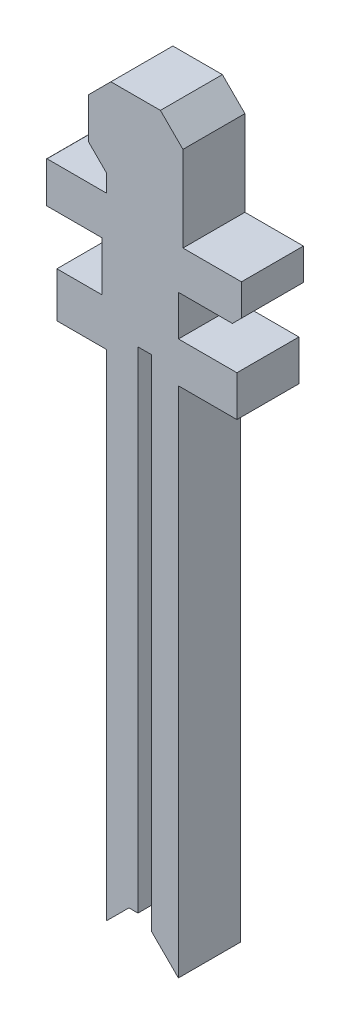
ISO-10303-21;
HEADER;
FILE_DESCRIPTION(('STEP AP214'),'2;1');
FILE_NAME('part.step','',(''),(''),'','','');
FILE_SCHEMA(('AUTOMOTIVE_DESIGN { 1 0 10303 214 1 1 1 1 }'));
ENDSEC;
DATA;
#1=APPLICATION_CONTEXT('core data for automotive mechanical design processes');
#2=APPLICATION_PROTOCOL_DEFINITION('international standard','automotive_design',2000,#1);
#3=PRODUCT_CONTEXT('',#1,'mechanical');
#4=PRODUCT('Part','Part','',(#3));
#5=PRODUCT_RELATED_PRODUCT_CATEGORY('part','',(#4));
#6=PRODUCT_DEFINITION_FORMATION('','',#4);
#7=PRODUCT_DEFINITION_CONTEXT('part definition',#1,'design');
#8=PRODUCT_DEFINITION('design','',#6,#7);
#9=PRODUCT_DEFINITION_SHAPE('','',#8);
#10=(LENGTH_UNIT() NAMED_UNIT(*) SI_UNIT(.MILLI.,.METRE.));
#11=(NAMED_UNIT(*) PLANE_ANGLE_UNIT() SI_UNIT($,.RADIAN.));
#12=(NAMED_UNIT(*) SI_UNIT($,.STERADIAN.) SOLID_ANGLE_UNIT());
#13=UNCERTAINTY_MEASURE_WITH_UNIT(LENGTH_MEASURE(1.E-05),#10,'distance_accuracy_value','');
#14=(GEOMETRIC_REPRESENTATION_CONTEXT(3) GLOBAL_UNCERTAINTY_ASSIGNED_CONTEXT((#13)) GLOBAL_UNIT_ASSIGNED_CONTEXT((#10,
#11,#12)) REPRESENTATION_CONTEXT('',''));
#15=CARTESIAN_POINT('',(0.,0.,0.));
#16=DIRECTION('',(0.,0.,1.));
#17=DIRECTION('',(1.,0.,0.));
#18=AXIS2_PLACEMENT_3D('',#15,#16,#17);
#19=CARTESIAN_POINT('',(-0.62866524,3.93915392,0.70000114));
#20=DIRECTION('',(0.,0.,-1.));
#21=DIRECTION('',(-1.,0.,0.));
#22=AXIS2_PLACEMENT_3D('',#19,#20,#21);
#23=PLANE('',#22);
#24=DIRECTION('',(-1.,0.,0.));
#25=VECTOR('',#24,1.);
#26=CARTESIAN_POINT('',(-0.62866524,-3.78711968,0.70000114));
#27=LINE('',#26,#25);
#28=CARTESIAN_POINT('',(-0.06854443999998,-3.78711968,0.70000114));
#29=VERTEX_POINT('',#28);
#30=CARTESIAN_POINT('',(-0.17046956,-3.78711968,0.70000114));
#31=VERTEX_POINT('',#30);
#32=EDGE_CURVE('E222',#29,#31,#27,.T.);
#33=ORIENTED_EDGE('',*,*,#32,.F.);
#34=DIRECTION('',(0.,1.,0.));
#35=VECTOR('',#34,1.);
#36=CARTESIAN_POINT('',(-0.06854443999998,-3.78711968,0.70000114));
#37=LINE('',#36,#35);
#38=CARTESIAN_POINT('',(-0.06854443999998,1.75305212,0.70000114));
#39=VERTEX_POINT('',#38);
#40=EDGE_CURVE('E456',#29,#39,#37,.T.);
#41=ORIENTED_EDGE('',*,*,#40,.T.);
#42=DIRECTION('',(1.,0.,0.));
#43=VECTOR('',#42,1.);
#44=CARTESIAN_POINT('',(-0.06854443999998,1.75305212,0.70000114));
#45=LINE('',#44,#43);
#46=CARTESIAN_POINT('',(0.08294116000002,1.75305212,0.70000114));
#47=VERTEX_POINT('',#46);
#48=EDGE_CURVE('E479',#39,#47,#45,.T.);
#49=ORIENTED_EDGE('',*,*,#48,.T.);
#50=DIRECTION('',(0.,1.,0.));
#51=VECTOR('',#50,1.);
#52=CARTESIAN_POINT('',(0.08294116000002,1.75305212,0.70000114));
#53=LINE('',#52,#51);
#54=CARTESIAN_POINT('',(0.08294116000002,-3.88849616,0.70000114));
#55=VERTEX_POINT('',#54);
#56=EDGE_CURVE('E252',#47,#55,#53,.F.);
#57=ORIENTED_EDGE('',*,*,#56,.T.);
#58=DIRECTION('',(-0.707300841758944,0.706912667340944,0.));
#59=VECTOR('',#58,1.);
#60=CARTESIAN_POINT('',(0.08294116000002,-3.88849616,0.70000114));
#61=LINE('',#60,#59);
#62=CARTESIAN_POINT('',(0.388582590884147,-4.19346289566701,0.70000114));
#63=VERTEX_POINT('',#62);
#64=EDGE_CURVE('E490',#55,#63,#61,.F.);
#65=ORIENTED_EDGE('',*,*,#64,.T.);
#66=DIRECTION('',(0.,1.,0.));
#67=VECTOR('',#66,1.);
#68=CARTESIAN_POINT('',(0.38890956,-4.19324028,0.70000114));
#69=LINE('',#68,#67);
#70=CARTESIAN_POINT('',(0.38890956,1.60057592,0.70000114));
#71=VERTEX_POINT('',#70);
#72=EDGE_CURVE('E290',#63,#71,#69,.T.);
#73=ORIENTED_EDGE('',*,*,#72,.T.);
#74=DIRECTION('',(1.,0.,0.));
#75=VECTOR('',#74,1.);
#76=CARTESIAN_POINT('',(0.38890956,1.60057592,0.70000114));
#77=LINE('',#76,#75);
#78=CARTESIAN_POINT('',(1.04966516,1.60057592,0.70000114));
#79=VERTEX_POINT('',#78);
#80=EDGE_CURVE('E301',#71,#79,#77,.T.);
#81=ORIENTED_EDGE('',*,*,#80,.T.);
#82=DIRECTION('',(0.,1.,0.));
#83=VECTOR('',#82,1.);
#84=CARTESIAN_POINT('',(1.04966516,1.60057592,0.70000114));
#85=LINE('',#84,#83);
#86=CARTESIAN_POINT('',(1.04966516,2.05904592,0.70000114));
#87=VERTEX_POINT('',#86);
#88=EDGE_CURVE('E306',#79,#87,#85,.T.);
#89=ORIENTED_EDGE('',*,*,#88,.T.);
#90=DIRECTION('',(1.,0.,0.));
#91=VECTOR('',#90,1.);
#92=CARTESIAN_POINT('',(1.04966516,2.05904592,0.70000114));
#93=LINE('',#92,#91);
#94=CARTESIAN_POINT('',(0.38890956,2.05904592,0.70000114));
#95=VERTEX_POINT('',#94);
#96=EDGE_CURVE('E311',#87,#95,#93,.F.);
#97=ORIENTED_EDGE('',*,*,#96,.T.);
#98=DIRECTION('',(0.,1.,0.));
#99=VECTOR('',#98,1.);
#100=CARTESIAN_POINT('',(0.38890956,2.05904592,0.70000114));
#101=LINE('',#100,#99);
#102=CARTESIAN_POINT('',(0.38890956,2.51548392,0.70000114));
#103=VERTEX_POINT('',#102);
#104=EDGE_CURVE('E316',#95,#103,#101,.T.);
#105=ORIENTED_EDGE('',*,*,#104,.T.);
#106=DIRECTION('',(1.,0.,0.));
#107=VECTOR('',#106,1.);
#108=CARTESIAN_POINT('',(0.38890956,2.51548392,0.70000114));
#109=LINE('',#108,#107);
#110=CARTESIAN_POINT('',(0.99854004,2.51548392,0.70000114));
#111=VERTEX_POINT('',#110);
#112=EDGE_CURVE('E321',#103,#111,#109,.T.);
#113=ORIENTED_EDGE('',*,*,#112,.T.);
#114=DIRECTION('',(-0.707106781186548,-0.707106781186548,0.));
#115=VECTOR('',#114,1.);
#116=CARTESIAN_POINT('',(0.99854004,2.51548392,0.70000114));
#117=LINE('',#116,#115);
#118=CARTESIAN_POINT('',(1.10049056,2.61743444,0.70000114));
#119=VERTEX_POINT('',#118);
#120=EDGE_CURVE('E326',#111,#119,#117,.F.);
#121=ORIENTED_EDGE('',*,*,#120,.T.);
#122=DIRECTION('',(0.,1.,0.));
#123=VECTOR('',#122,1.);
#124=CARTESIAN_POINT('',(1.10049056,2.61743444,0.70000114));
#125=LINE('',#124,#123);
#126=CARTESIAN_POINT('',(1.10049056,2.97392852,0.70000114));
#127=VERTEX_POINT('',#126);
#128=EDGE_CURVE('E331',#119,#127,#125,.T.);
#129=ORIENTED_EDGE('',*,*,#128,.T.);
#130=DIRECTION('',(1.,0.,0.));
#131=VECTOR('',#130,1.);
#132=CARTESIAN_POINT('',(1.10049056,2.97392852,0.70000114));
#133=LINE('',#132,#131);
#134=CARTESIAN_POINT('',(0.43973496,2.97392852,0.70000114));
#135=VERTEX_POINT('',#134);
#136=EDGE_CURVE('E336',#127,#135,#133,.F.);
#137=ORIENTED_EDGE('',*,*,#136,.T.);
#138=DIRECTION('',(0.,1.,0.));
#139=VECTOR('',#138,1.);
#140=CARTESIAN_POINT('',(0.43973496,2.97392852,0.70000114));
#141=LINE('',#140,#139);
#142=CARTESIAN_POINT('',(0.43973496,3.9393622,0.70000114));
#143=VERTEX_POINT('',#142);
#144=EDGE_CURVE('E341',#135,#143,#141,.T.);
#145=ORIENTED_EDGE('',*,*,#144,.T.);
#146=DIRECTION('',(0.707106781186548,-0.707106781186548,0.));
#147=VECTOR('',#146,1.);
#148=CARTESIAN_POINT('',(0.43973496,3.9393622,0.70000114));
#149=LINE('',#148,#147);
#150=CARTESIAN_POINT('',(0.18530824,4.19378892,0.70000114));
#151=VERTEX_POINT('',#150);
#152=EDGE_CURVE('E346',#143,#151,#149,.F.);
#153=ORIENTED_EDGE('',*,*,#152,.T.);
#154=DIRECTION('',(1.,0.,0.));
#155=VECTOR('',#154,1.);
#156=CARTESIAN_POINT('',(0.18530824,4.19378892,0.70000114));
#157=LINE('',#156,#155);
#158=CARTESIAN_POINT('',(-0.37423852,4.19378892,0.70000114));
#159=VERTEX_POINT('',#158);
#160=EDGE_CURVE('E351',#151,#159,#157,.F.);
#161=ORIENTED_EDGE('',*,*,#160,.T.);
#162=DIRECTION('',(0.706873902888643,0.707339582813643,0.));
#163=VECTOR('',#162,1.);
#164=CARTESIAN_POINT('',(-0.37423852,4.19378892,0.70000114));
#165=LINE('',#164,#163);
#166=CARTESIAN_POINT('',(-0.628670601009899,3.93917850830667,0.70000114));
#167=VERTEX_POINT('',#166);
#168=EDGE_CURVE('E587',#159,#167,#165,.F.);
#169=ORIENTED_EDGE('',*,*,#168,.T.);
#170=DIRECTION('',(0.,1.,0.));
#171=VECTOR('',#170,1.);
#172=CARTESIAN_POINT('',(-0.62866524,3.93915392,0.70000114));
#173=LINE('',#172,#171);
#174=CARTESIAN_POINT('',(-0.62866524,3.48151704,0.70000114));
#175=VERTEX_POINT('',#174);
#176=EDGE_CURVE('E388',#167,#175,#173,.F.);
#177=ORIENTED_EDGE('',*,*,#176,.T.);
#178=DIRECTION('',(-0.707106781186548,0.707106781186548,0.));
#179=VECTOR('',#178,1.);
#180=CARTESIAN_POINT('',(-0.62866524,3.48151704,0.70000114));
#181=LINE('',#180,#179);
#182=CARTESIAN_POINT('',(-0.42533824,3.27819004,0.70000114));
#183=VERTEX_POINT('',#182);
#184=EDGE_CURVE('E399',#175,#183,#181,.F.);
#185=ORIENTED_EDGE('',*,*,#184,.T.);
#186=DIRECTION('',(0.,1.,0.));
#187=VECTOR('',#186,1.);
#188=CARTESIAN_POINT('',(-0.42533824,3.27819004,0.70000114));
#189=LINE('',#188,#187);
#190=CARTESIAN_POINT('',(-0.42533824,3.07919374,0.70000114));
#191=VERTEX_POINT('',#190);
#192=EDGE_CURVE('E404',#183,#191,#189,.F.);
#193=ORIENTED_EDGE('',*,*,#192,.T.);
#194=DIRECTION('',(0.999999562297726,-0.000935630459489344,0.));
#195=VECTOR('',#194,1.);
#196=CARTESIAN_POINT('',(-0.42533824,3.07919374,0.70000114));
#197=LINE('',#196,#195);
#198=CARTESIAN_POINT('',(-1.09588046,3.07982112000001,0.70000114));
#199=VERTEX_POINT('',#198);
#200=EDGE_CURVE('E409',#191,#199,#197,.F.);
#201=ORIENTED_EDGE('',*,*,#200,.T.);
#202=DIRECTION('',(0.899966585375299,0.435958880180145,0.));
#203=VECTOR('',#202,1.);
#204=CARTESIAN_POINT('',(-1.09588046,3.07982112,0.70000114));
#205=LINE('',#204,#203);
#206=CARTESIAN_POINT('',(-1.09873288,3.07843936,0.70000114));
#207=VERTEX_POINT('',#206);
#208=EDGE_CURVE('E414',#199,#207,#205,.F.);
#209=ORIENTED_EDGE('',*,*,#208,.T.);
#210=DIRECTION('',(0.725732180307284,0.687977327000269,0.));
#211=VECTOR('',#210,1.);
#212=CARTESIAN_POINT('',(-1.09873288,3.07843936,0.70000114));
#213=LINE('',#212,#211);
#214=CARTESIAN_POINT('',(-1.10049056,3.07677312,0.70000114));
#215=VERTEX_POINT('',#214);
#216=EDGE_CURVE('E419',#207,#215,#213,.F.);
#217=ORIENTED_EDGE('',*,*,#216,.T.);
#218=DIRECTION('',(0.,1.,0.));
#219=VECTOR('',#218,1.);
#220=CARTESIAN_POINT('',(-1.10049056,3.07677312,0.70000114));
#221=LINE('',#220,#219);
#222=CARTESIAN_POINT('',(-1.10049056,2.61713472,0.70000114));
#223=VERTEX_POINT('',#222);
#224=EDGE_CURVE('E424',#215,#223,#221,.F.);
#225=ORIENTED_EDGE('',*,*,#224,.T.);
#226=DIRECTION('',(1.,0.,0.));
#227=VECTOR('',#226,1.);
#228=CARTESIAN_POINT('',(-1.10049056,2.61713472,0.70000114));
#229=LINE('',#228,#227);
#230=CARTESIAN_POINT('',(-0.47616364,2.61713472,0.70000114));
#231=VERTEX_POINT('',#230);
#232=EDGE_CURVE('E429',#223,#231,#229,.T.);
#233=ORIENTED_EDGE('',*,*,#232,.T.);
#234=DIRECTION('',(0.,1.,0.));
#235=VECTOR('',#234,1.);
#236=CARTESIAN_POINT('',(-0.47616364,2.61713472,0.70000114));
#237=LINE('',#236,#235);
#238=CARTESIAN_POINT('',(-0.47616364,2.05904592,0.70000114));
#239=VERTEX_POINT('',#238);
#240=EDGE_CURVE('E434',#231,#239,#237,.F.);
#241=ORIENTED_EDGE('',*,*,#240,.T.);
#242=DIRECTION('',(1.,0.,0.));
#243=VECTOR('',#242,1.);
#244=CARTESIAN_POINT('',(-0.47616364,2.05904592,0.70000114));
#245=LINE('',#244,#243);
#246=CARTESIAN_POINT('',(-0.98444304,2.05904592,0.70000114));
#247=VERTEX_POINT('',#246);
#248=EDGE_CURVE('E439',#239,#247,#245,.F.);
#249=ORIENTED_EDGE('',*,*,#248,.T.);
#250=DIRECTION('',(0.,1.,0.));
#251=VECTOR('',#250,1.);
#252=CARTESIAN_POINT('',(-0.98444304,2.05904592,0.70000114));
#253=LINE('',#252,#251);
#254=CARTESIAN_POINT('',(-0.98444304,1.54975052,0.70000114));
#255=VERTEX_POINT('',#254);
#256=EDGE_CURVE('E444',#247,#255,#253,.F.);
#257=ORIENTED_EDGE('',*,*,#256,.T.);
#258=DIRECTION('',(1.,0.,0.));
#259=VECTOR('',#258,1.);
#260=CARTESIAN_POINT('',(-0.98444304,1.54975052,0.70000114));
#261=LINE('',#260,#259);
#262=CARTESIAN_POINT('',(-0.42533824,1.54975052,0.70000114));
#263=VERTEX_POINT('',#262);
#264=EDGE_CURVE('E242',#255,#263,#261,.T.);
#265=ORIENTED_EDGE('',*,*,#264,.T.);
#266=DIRECTION('',(-9.08592831262369E-05,0.999999995872295,0.));
#267=VECTOR('',#266,1.);
#268=CARTESIAN_POINT('',(-0.42533824,1.54975052,0.70000114));
#269=LINE('',#268,#267);
#270=CARTESIAN_POINT('',(-0.424677193663149,-4.04114315684987,0.70000114));
#271=VERTEX_POINT('',#270);
#272=EDGE_CURVE('E239',#263,#271,#269,.F.);
#273=ORIENTED_EDGE('',*,*,#272,.T.);
#274=DIRECTION('',(-0.707106781186549,-0.707106781186546,0.));
#275=VECTOR('',#274,1.);
#276=CARTESIAN_POINT('',(-0.17046956,-3.78711968,0.70000114));
#277=LINE('',#276,#275);
#278=EDGE_CURVE('E228',#31,#271,#277,.T.);
#279=ORIENTED_EDGE('',*,*,#278,.F.);
#280=EDGE_LOOP('',(#33,#41,#49,#57,#65,#73,#81,#89,#97,#105,#113,#121,#129,#137,#145,#153,#161,
#169,#177,#185,#193,#201,#209,#217,#225,#233,#241,#249,#257,#265,#273,#279));
#281=FACE_BOUND('',#280,.T.);
#282=ADVANCED_FACE('F17',(#281),#23,.F.);
#283=CARTESIAN_POINT('',(-0.42533824,1.54975052,0.));
#284=DIRECTION('',(0.999999995872295,9.08592831262369E-05,0.));
#285=DIRECTION('',(-9.08592831262369E-05,0.999999995872295,0.));
#286=AXIS2_PLACEMENT_3D('',#283,#284,#285);
#287=PLANE('',#286);
#288=DIRECTION('',(0.,0.,1.));
#289=VECTOR('',#288,1.);
#290=CARTESIAN_POINT('',(-0.424830224769737,-4.04148034476974,0.));
#291=LINE('',#290,#289);
#292=CARTESIAN_POINT('',(-0.424677193663143,-4.04114315684987,0.));
#293=VERTEX_POINT('',#292);
#294=EDGE_CURVE('E236',#293,#271,#291,.T.);
#295=ORIENTED_EDGE('',*,*,#294,.T.);
#296=ORIENTED_EDGE('',*,*,#272,.F.);
#297=DIRECTION('',(0.,0.,1.));
#298=VECTOR('',#297,1.);
#299=CARTESIAN_POINT('',(-0.42533824,1.54975052,0.));
#300=LINE('',#299,#298);
#301=CARTESIAN_POINT('',(-0.42533824,1.54975052,0.));
#302=VERTEX_POINT('',#301);
#303=EDGE_CURVE('E446',#263,#302,#300,.F.);
#304=ORIENTED_EDGE('',*,*,#303,.T.);
#305=DIRECTION('',(-9.08592831310438E-05,0.999999995872295,0.));
#306=VECTOR('',#305,1.);
#307=CARTESIAN_POINT('',(-0.424830269181,-4.040991552779,0.));
#308=LINE('',#307,#306);
#309=EDGE_CURVE('E235',#293,#302,#308,.T.);
#310=ORIENTED_EDGE('',*,*,#309,.F.);
#311=EDGE_LOOP('',(#295,#296,#304,#310));
#312=FACE_BOUND('',#311,.T.);
#313=ADVANCED_FACE('F1002',(#312),#287,.F.);
#314=CARTESIAN_POINT('',(-0.98444304,1.54975052,0.));
#315=DIRECTION('',(0.,1.,0.));
#316=DIRECTION('',(0.,0.,1.));
#317=AXIS2_PLACEMENT_3D('',#314,#315,#316);
#318=PLANE('',#317);
#319=ORIENTED_EDGE('',*,*,#303,.F.);
#320=ORIENTED_EDGE('',*,*,#264,.F.);
#321=DIRECTION('',(0.,0.,-1.));
#322=VECTOR('',#321,1.);
#323=CARTESIAN_POINT('',(-0.98444304,1.54975052,0.));
#324=LINE('',#323,#322);
#325=CARTESIAN_POINT('',(-0.98444304,1.54975052,0.));
#326=VERTEX_POINT('',#325);
#327=EDGE_CURVE('E441',#255,#326,#324,.T.);
#328=ORIENTED_EDGE('',*,*,#327,.T.);
#329=DIRECTION('',(-1.,0.,0.));
#330=VECTOR('',#329,1.);
#331=CARTESIAN_POINT('',(-0.62866524,1.54975052,0.));
#332=LINE('',#331,#330);
#333=EDGE_CURVE('E670',#302,#326,#332,.T.);
#334=ORIENTED_EDGE('',*,*,#333,.F.);
#335=EDGE_LOOP('',(#319,#320,#328,#334));
#336=FACE_BOUND('',#335,.T.);
#337=ADVANCED_FACE('F992',(#336),#318,.F.);
#338=CARTESIAN_POINT('',(-0.98444304,2.05904592,0.));
#339=DIRECTION('',(1.,0.,0.));
#340=DIRECTION('',(0.,0.,-1.));
#341=AXIS2_PLACEMENT_3D('',#338,#339,#340);
#342=PLANE('',#341);
#343=ORIENTED_EDGE('',*,*,#327,.F.);
#344=ORIENTED_EDGE('',*,*,#256,.F.);
#345=DIRECTION('',(0.,0.,-1.));
#346=VECTOR('',#345,1.);
#347=CARTESIAN_POINT('',(-0.98444304,2.05904592,0.));
#348=LINE('',#347,#346);
#349=CARTESIAN_POINT('',(-0.98444304,2.05904592,0.));
#350=VERTEX_POINT('',#349);
#351=EDGE_CURVE('E436',#247,#350,#348,.T.);
#352=ORIENTED_EDGE('',*,*,#351,.T.);
#353=DIRECTION('',(0.,1.,0.));
#354=VECTOR('',#353,1.);
#355=CARTESIAN_POINT('',(-0.98444304,3.93915392,0.));
#356=LINE('',#355,#354);
#357=EDGE_CURVE('E662',#326,#350,#356,.T.);
#358=ORIENTED_EDGE('',*,*,#357,.F.);
#359=EDGE_LOOP('',(#343,#344,#352,#358));
#360=FACE_BOUND('',#359,.T.);
#361=ADVANCED_FACE('F982',(#360),#342,.F.);
#362=CARTESIAN_POINT('',(-0.47616364,2.05904592,0.));
#363=DIRECTION('',(0.,-1.,0.));
#364=DIRECTION('',(0.,0.,-1.));
#365=AXIS2_PLACEMENT_3D('',#362,#363,#364);
#366=PLANE('',#365);
#367=ORIENTED_EDGE('',*,*,#351,.F.);
#368=ORIENTED_EDGE('',*,*,#248,.F.);
#369=DIRECTION('',(0.,0.,-1.));
#370=VECTOR('',#369,1.);
#371=CARTESIAN_POINT('',(-0.47616364,2.05904592,0.));
#372=LINE('',#371,#370);
#373=CARTESIAN_POINT('',(-0.47616364,2.05904592,0.));
#374=VERTEX_POINT('',#373);
#375=EDGE_CURVE('E431',#239,#374,#372,.T.);
#376=ORIENTED_EDGE('',*,*,#375,.T.);
#377=DIRECTION('',(-1.,0.,0.));
#378=VECTOR('',#377,1.);
#379=CARTESIAN_POINT('',(-0.62866524,2.05904592,0.));
#380=LINE('',#379,#378);
#381=EDGE_CURVE('E654',#350,#374,#380,.F.);
#382=ORIENTED_EDGE('',*,*,#381,.F.);
#383=EDGE_LOOP('',(#367,#368,#376,#382));
#384=FACE_BOUND('',#383,.T.);
#385=ADVANCED_FACE('F972',(#384),#366,.F.);
#386=CARTESIAN_POINT('',(-0.47616364,2.61713472,0.));
#387=DIRECTION('',(1.,0.,0.));
#388=DIRECTION('',(0.,0.,-1.));
#389=AXIS2_PLACEMENT_3D('',#386,#387,#388);
#390=PLANE('',#389);
#391=ORIENTED_EDGE('',*,*,#375,.F.);
#392=ORIENTED_EDGE('',*,*,#240,.F.);
#393=DIRECTION('',(0.,0.,1.));
#394=VECTOR('',#393,1.);
#395=CARTESIAN_POINT('',(-0.47616364,2.61713472,0.));
#396=LINE('',#395,#394);
#397=CARTESIAN_POINT('',(-0.47616364,2.61713472,0.));
#398=VERTEX_POINT('',#397);
#399=EDGE_CURVE('E426',#231,#398,#396,.F.);
#400=ORIENTED_EDGE('',*,*,#399,.T.);
#401=DIRECTION('',(0.,1.,0.));
#402=VECTOR('',#401,1.);
#403=CARTESIAN_POINT('',(-0.47616364,3.93915392,0.));
#404=LINE('',#403,#402);
#405=EDGE_CURVE('E646',#374,#398,#404,.T.);
#406=ORIENTED_EDGE('',*,*,#405,.F.);
#407=EDGE_LOOP('',(#391,#392,#400,#406));
#408=FACE_BOUND('',#407,.T.);
#409=ADVANCED_FACE('F962',(#408),#390,.F.);
#410=CARTESIAN_POINT('',(-1.10049056,2.61713472,0.));
#411=DIRECTION('',(0.,1.,0.));
#412=DIRECTION('',(0.,0.,1.));
#413=AXIS2_PLACEMENT_3D('',#410,#411,#412);
#414=PLANE('',#413);
#415=ORIENTED_EDGE('',*,*,#399,.F.);
#416=ORIENTED_EDGE('',*,*,#232,.F.);
#417=DIRECTION('',(0.,0.,-1.));
#418=VECTOR('',#417,1.);
#419=CARTESIAN_POINT('',(-1.10049056,2.61713472,0.));
#420=LINE('',#419,#418);
#421=CARTESIAN_POINT('',(-1.10049056,2.61713472,0.));
#422=VERTEX_POINT('',#421);
#423=EDGE_CURVE('E421',#223,#422,#420,.T.);
#424=ORIENTED_EDGE('',*,*,#423,.T.);
#425=DIRECTION('',(-1.,0.,0.));
#426=VECTOR('',#425,1.);
#427=CARTESIAN_POINT('',(-0.62866524,2.61713472,0.));
#428=LINE('',#427,#426);
#429=EDGE_CURVE('E638',#398,#422,#428,.T.);
#430=ORIENTED_EDGE('',*,*,#429,.F.);
#431=EDGE_LOOP('',(#415,#416,#424,#430));
#432=FACE_BOUND('',#431,.T.);
#433=ADVANCED_FACE('F952',(#432),#414,.F.);
#434=CARTESIAN_POINT('',(-1.10049056,3.07677312,0.));
#435=DIRECTION('',(1.,0.,0.));
#436=DIRECTION('',(0.,0.,-1.));
#437=AXIS2_PLACEMENT_3D('',#434,#435,#436);
#438=PLANE('',#437);
#439=ORIENTED_EDGE('',*,*,#423,.F.);
#440=ORIENTED_EDGE('',*,*,#224,.F.);
#441=DIRECTION('',(0.,0.,1.));
#442=VECTOR('',#441,1.);
#443=CARTESIAN_POINT('',(-1.10049056,3.07677312,0.));
#444=LINE('',#443,#442);
#445=CARTESIAN_POINT('',(-1.10049056,3.07677312,0.));
#446=VERTEX_POINT('',#445);
#447=EDGE_CURVE('E416',#215,#446,#444,.F.);
#448=ORIENTED_EDGE('',*,*,#447,.T.);
#449=DIRECTION('',(0.,1.,0.));
#450=VECTOR('',#449,1.);
#451=CARTESIAN_POINT('',(-1.10049056,3.93915392,0.));
#452=LINE('',#451,#450);
#453=EDGE_CURVE('E630',#422,#446,#452,.T.);
#454=ORIENTED_EDGE('',*,*,#453,.F.);
#455=EDGE_LOOP('',(#439,#440,#448,#454));
#456=FACE_BOUND('',#455,.T.);
#457=ADVANCED_FACE('F942',(#456),#438,.F.);
#458=CARTESIAN_POINT('',(-1.09873288,3.07843936,0.));
#459=DIRECTION('',(0.687977327000269,-0.725732180307284,0.));
#460=DIRECTION('',(0.725732180307284,0.687977327000269,0.));
#461=AXIS2_PLACEMENT_3D('',#458,#459,#460);
#462=PLANE('',#461);
#463=ORIENTED_EDGE('',*,*,#447,.F.);
#464=ORIENTED_EDGE('',*,*,#216,.F.);
#465=DIRECTION('',(0.,0.,1.));
#466=VECTOR('',#465,1.);
#467=CARTESIAN_POINT('',(-1.09873288,3.07843936,0.));
#468=LINE('',#467,#466);
#469=CARTESIAN_POINT('',(-1.09873288,3.07843936,0.));
#470=VERTEX_POINT('',#469);
#471=EDGE_CURVE('E411',#207,#470,#468,.F.);
#472=ORIENTED_EDGE('',*,*,#471,.T.);
#473=DIRECTION('',(0.725732180309167,0.687977326998283,0.));
#474=VECTOR('',#473,1.);
#475=CARTESIAN_POINT('',(-1.10049056,3.07677312,0.));
#476=LINE('',#475,#474);
#477=EDGE_CURVE('E622',#446,#470,#476,.T.);
#478=ORIENTED_EDGE('',*,*,#477,.F.);
#479=EDGE_LOOP('',(#463,#464,#472,#478));
#480=FACE_BOUND('',#479,.T.);
#481=ADVANCED_FACE('F932',(#480),#462,.F.);
#482=CARTESIAN_POINT('',(-1.09588046,3.07982112,0.));
#483=DIRECTION('',(0.435958880180145,-0.899966585375299,0.));
#484=DIRECTION('',(0.899966585375299,0.435958880180145,0.));
#485=AXIS2_PLACEMENT_3D('',#482,#483,#484);
#486=PLANE('',#485);
#487=ORIENTED_EDGE('',*,*,#471,.F.);
#488=ORIENTED_EDGE('',*,*,#208,.F.);
#489=DIRECTION('',(0.,0.,1.));
#490=VECTOR('',#489,1.);
#491=CARTESIAN_POINT('',(-1.09588046,3.07982112000001,0.));
#492=LINE('',#491,#490);
#493=CARTESIAN_POINT('',(-1.09588046,3.07982112,0.));
#494=VERTEX_POINT('',#493);
#495=EDGE_CURVE('E406',#199,#494,#492,.F.);
#496=ORIENTED_EDGE('',*,*,#495,.T.);
#497=DIRECTION('',(0.899966585374593,0.435958880181602,0.));
#498=VECTOR('',#497,1.);
#499=CARTESIAN_POINT('',(-1.09873288,3.07843936,0.));
#500=LINE('',#499,#498);
#501=EDGE_CURVE('E614',#470,#494,#500,.T.);
#502=ORIENTED_EDGE('',*,*,#501,.F.);
#503=EDGE_LOOP('',(#487,#488,#496,#502));
#504=FACE_BOUND('',#503,.T.);
#505=ADVANCED_FACE('F922',(#504),#486,.F.);
#506=CARTESIAN_POINT('',(-0.42533824,3.07919374,0.));
#507=DIRECTION('',(-0.000935630459489344,-0.999999562297726,0.));
#508=DIRECTION('',(0.999999562297726,-0.000935630459489344,0.));
#509=AXIS2_PLACEMENT_3D('',#506,#507,#508);
#510=PLANE('',#509);
#511=ORIENTED_EDGE('',*,*,#495,.F.);
#512=ORIENTED_EDGE('',*,*,#200,.F.);
#513=DIRECTION('',(0.,0.,-1.));
#514=VECTOR('',#513,1.);
#515=CARTESIAN_POINT('',(-0.42533824,3.07919374,0.));
#516=LINE('',#515,#514);
#517=CARTESIAN_POINT('',(-0.42533824,3.07919374,0.));
#518=VERTEX_POINT('',#517);
#519=EDGE_CURVE('E401',#191,#518,#516,.T.);
#520=ORIENTED_EDGE('',*,*,#519,.T.);
#521=DIRECTION('',(0.999999562297726,-0.000935630459472887,0.));
#522=VECTOR('',#521,1.);
#523=CARTESIAN_POINT('',(-1.09588046,3.07982112,0.));
#524=LINE('',#523,#522);
#525=EDGE_CURVE('E606',#494,#518,#524,.T.);
#526=ORIENTED_EDGE('',*,*,#525,.F.);
#527=EDGE_LOOP('',(#511,#512,#520,#526));
#528=FACE_BOUND('',#527,.T.);
#529=ADVANCED_FACE('F913',(#528),#510,.F.);
#530=CARTESIAN_POINT('',(-0.42533824,3.27819004,0.));
#531=DIRECTION('',(1.,0.,0.));
#532=DIRECTION('',(0.,0.,-1.));
#533=AXIS2_PLACEMENT_3D('',#530,#531,#532);
#534=PLANE('',#533);
#535=ORIENTED_EDGE('',*,*,#519,.F.);
#536=ORIENTED_EDGE('',*,*,#192,.F.);
#537=DIRECTION('',(0.,0.,1.));
#538=VECTOR('',#537,1.);
#539=CARTESIAN_POINT('',(-0.42533824,3.27819004,0.));
#540=LINE('',#539,#538);
#541=CARTESIAN_POINT('',(-0.42533824,3.27819004,0.));
#542=VERTEX_POINT('',#541);
#543=EDGE_CURVE('E396',#183,#542,#540,.F.);
#544=ORIENTED_EDGE('',*,*,#543,.T.);
#545=DIRECTION('',(0.,1.,0.));
#546=VECTOR('',#545,1.);
#547=CARTESIAN_POINT('',(-0.42533824,3.93915392,0.));
#548=LINE('',#547,#546);
#549=EDGE_CURVE('E598',#518,#542,#548,.T.);
#550=ORIENTED_EDGE('',*,*,#549,.F.);
#551=EDGE_LOOP('',(#535,#536,#544,#550));
#552=FACE_BOUND('',#551,.T.);
#553=ADVANCED_FACE('F904',(#552),#534,.F.);
#554=CARTESIAN_POINT('',(-0.62866524,3.48151704,0.));
#555=DIRECTION('',(0.707106781186548,0.707106781186548,0.));
#556=DIRECTION('',(-0.707106781186548,0.707106781186548,0.));
#557=AXIS2_PLACEMENT_3D('',#554,#555,#556);
#558=PLANE('',#557);
#559=ORIENTED_EDGE('',*,*,#543,.F.);
#560=ORIENTED_EDGE('',*,*,#184,.F.);
#561=DIRECTION('',(0.,0.,-1.));
#562=VECTOR('',#561,1.);
#563=CARTESIAN_POINT('',(-0.62866524,3.48151704,0.));
#564=LINE('',#563,#562);
#565=CARTESIAN_POINT('',(-0.62866524,3.48151704,0.));
#566=VERTEX_POINT('',#565);
#567=EDGE_CURVE('E395',#175,#566,#564,.T.);
#568=ORIENTED_EDGE('',*,*,#567,.T.);
#569=DIRECTION('',(-0.707106781186547,0.707106781186548,0.));
#570=VECTOR('',#569,1.);
#571=CARTESIAN_POINT('',(-0.42533824,3.27819004,0.));
#572=LINE('',#571,#570);
#573=EDGE_CURVE('E594',#542,#566,#572,.T.);
#574=ORIENTED_EDGE('',*,*,#573,.F.);
#575=EDGE_LOOP('',(#559,#560,#568,#574));
#576=FACE_BOUND('',#575,.T.);
#577=ADVANCED_FACE('F382',(#576),#558,.F.);
#578=CARTESIAN_POINT('',(-0.62866524,3.93915392,0.));
#579=DIRECTION('',(1.,0.,0.));
#580=DIRECTION('',(0.,0.,-1.));
#581=AXIS2_PLACEMENT_3D('',#578,#579,#580);
#582=PLANE('',#581);
#583=ORIENTED_EDGE('',*,*,#567,.F.);
#584=ORIENTED_EDGE('',*,*,#176,.F.);
#585=CARTESIAN_POINT('',(-0.62866524,3.93915392,0.70000114));
#586=DIRECTION('',(0.,0.,-1.));
#587=VECTOR('',#586,1.);
#588=LINE('',#585,#587);
#589=CARTESIAN_POINT('',(-0.628670601009975,3.93917850830677,0.));
#590=VERTEX_POINT('',#589);
#591=EDGE_CURVE('E353',#167,#590,#588,.T.);
#592=ORIENTED_EDGE('',*,*,#591,.T.);
#593=DIRECTION('',(0.,1.,0.));
#594=VECTOR('',#593,1.);
#595=CARTESIAN_POINT('',(-0.62866524,3.93915392,0.));
#596=LINE('',#595,#594);
#597=EDGE_CURVE('E597',#566,#590,#596,.T.);
#598=ORIENTED_EDGE('',*,*,#597,.F.);
#599=EDGE_LOOP('',(#583,#584,#592,#598));
#600=FACE_BOUND('',#599,.T.);
#601=ADVANCED_FACE('F377',(#600),#582,.F.);
#602=CARTESIAN_POINT('',(-0.37423852,4.19378892,0.));
#603=DIRECTION('',(0.707339582813643,-0.706873902888643,0.));
#604=DIRECTION('',(0.706873902888643,0.707339582813643,0.));
#605=AXIS2_PLACEMENT_3D('',#602,#603,#604);
#606=PLANE('',#605);
#607=ORIENTED_EDGE('',*,*,#591,.F.);
#608=ORIENTED_EDGE('',*,*,#168,.F.);
#609=DIRECTION('',(0.,0.,-1.));
#610=VECTOR('',#609,1.);
#611=CARTESIAN_POINT('',(-0.37423852,4.19378892,0.));
#612=LINE('',#611,#610);
#613=CARTESIAN_POINT('',(-0.37423852,4.19378892,0.));
#614=VERTEX_POINT('',#613);
#615=EDGE_CURVE('E348',#159,#614,#612,.T.);
#616=ORIENTED_EDGE('',*,*,#615,.T.);
#617=DIRECTION('',(0.706873902889364,0.707339582812921,0.));
#618=VECTOR('',#617,1.);
#619=CARTESIAN_POINT('',(-0.628647203238,3.939212635418,0.));
#620=LINE('',#619,#618);
#621=EDGE_CURVE('E581',#590,#614,#620,.T.);
#622=ORIENTED_EDGE('',*,*,#621,.F.);
#623=EDGE_LOOP('',(#607,#608,#616,#622));
#624=FACE_BOUND('',#623,.T.);
#625=ADVANCED_FACE('F366',(#624),#606,.F.);
#626=CARTESIAN_POINT('',(0.18530824,4.19378892,0.));
#627=DIRECTION('',(0.,-1.,0.));
#628=DIRECTION('',(0.,0.,-1.));
#629=AXIS2_PLACEMENT_3D('',#626,#627,#628);
#630=PLANE('',#629);
#631=ORIENTED_EDGE('',*,*,#615,.F.);
#632=ORIENTED_EDGE('',*,*,#160,.F.);
#633=DIRECTION('',(0.,0.,1.));
#634=VECTOR('',#633,1.);
#635=CARTESIAN_POINT('',(0.18530824,4.19378892,0.));
#636=LINE('',#635,#634);
#637=CARTESIAN_POINT('',(0.18530824,4.19378892,0.));
#638=VERTEX_POINT('',#637);
#639=EDGE_CURVE('E343',#151,#638,#636,.F.);
#640=ORIENTED_EDGE('',*,*,#639,.T.);
#641=DIRECTION('',(-1.,0.,0.));
#642=VECTOR('',#641,1.);
#643=CARTESIAN_POINT('',(-0.62866524,4.19378892,0.));
#644=LINE('',#643,#642);
#645=EDGE_CURVE('E573',#614,#638,#644,.F.);
#646=ORIENTED_EDGE('',*,*,#645,.F.);
#647=EDGE_LOOP('',(#631,#632,#640,#646));
#648=FACE_BOUND('',#647,.T.);
#649=ADVANCED_FACE('F376',(#648),#630,.F.);
#650=CARTESIAN_POINT('',(0.43973496,3.9393622,0.));
#651=DIRECTION('',(-0.707106781186548,-0.707106781186548,0.));
#652=DIRECTION('',(0.707106781186548,-0.707106781186548,0.));
#653=AXIS2_PLACEMENT_3D('',#650,#651,#652);
#654=PLANE('',#653);
#655=ORIENTED_EDGE('',*,*,#639,.F.);
#656=ORIENTED_EDGE('',*,*,#152,.F.);
#657=DIRECTION('',(0.,0.,1.));
#658=VECTOR('',#657,1.);
#659=CARTESIAN_POINT('',(0.43973496,3.9393622,0.));
#660=LINE('',#659,#658);
#661=CARTESIAN_POINT('',(0.43973496,3.9393622,0.));
#662=VERTEX_POINT('',#661);
#663=EDGE_CURVE('E338',#143,#662,#660,.F.);
#664=ORIENTED_EDGE('',*,*,#663,.T.);
#665=DIRECTION('',(0.707106781186547,-0.707106781186548,0.));
#666=VECTOR('',#665,1.);
#667=CARTESIAN_POINT('',(0.18530824,4.19378892,0.));
#668=LINE('',#667,#666);
#669=EDGE_CURVE('E565',#638,#662,#668,.T.);
#670=ORIENTED_EDGE('',*,*,#669,.F.);
#671=EDGE_LOOP('',(#655,#656,#664,#670));
#672=FACE_BOUND('',#671,.T.);
#673=ADVANCED_FACE('F866',(#672),#654,.F.);
#674=CARTESIAN_POINT('',(0.43973496,2.97392852,0.));
#675=DIRECTION('',(-1.,0.,0.));
#676=DIRECTION('',(0.,0.,1.));
#677=AXIS2_PLACEMENT_3D('',#674,#675,#676);
#678=PLANE('',#677);
#679=ORIENTED_EDGE('',*,*,#663,.F.);
#680=ORIENTED_EDGE('',*,*,#144,.F.);
#681=DIRECTION('',(0.,0.,-1.));
#682=VECTOR('',#681,1.);
#683=CARTESIAN_POINT('',(0.43973496,2.97392852,0.));
#684=LINE('',#683,#682);
#685=CARTESIAN_POINT('',(0.43973496,2.97392852,0.));
#686=VERTEX_POINT('',#685);
#687=EDGE_CURVE('E333',#135,#686,#684,.T.);
#688=ORIENTED_EDGE('',*,*,#687,.T.);
#689=DIRECTION('',(0.,1.,0.));
#690=VECTOR('',#689,1.);
#691=CARTESIAN_POINT('',(0.43973496,3.93915392,0.));
#692=LINE('',#691,#690);
#693=EDGE_CURVE('E557',#662,#686,#692,.F.);
#694=ORIENTED_EDGE('',*,*,#693,.F.);
#695=EDGE_LOOP('',(#679,#680,#688,#694));
#696=FACE_BOUND('',#695,.T.);
#697=ADVANCED_FACE('F856',(#696),#678,.F.);
#698=CARTESIAN_POINT('',(1.10049056,2.97392852,0.));
#699=DIRECTION('',(0.,-1.,0.));
#700=DIRECTION('',(0.,0.,-1.));
#701=AXIS2_PLACEMENT_3D('',#698,#699,#700);
#702=PLANE('',#701);
#703=ORIENTED_EDGE('',*,*,#687,.F.);
#704=ORIENTED_EDGE('',*,*,#136,.F.);
#705=DIRECTION('',(0.,0.,1.));
#706=VECTOR('',#705,1.);
#707=CARTESIAN_POINT('',(1.10049056,2.97392852,0.));
#708=LINE('',#707,#706);
#709=CARTESIAN_POINT('',(1.10049056,2.97392852,0.));
#710=VERTEX_POINT('',#709);
#711=EDGE_CURVE('E328',#127,#710,#708,.F.);
#712=ORIENTED_EDGE('',*,*,#711,.T.);
#713=DIRECTION('',(-1.,0.,0.));
#714=VECTOR('',#713,1.);
#715=CARTESIAN_POINT('',(-0.62866524,2.97392852,0.));
#716=LINE('',#715,#714);
#717=EDGE_CURVE('E549',#686,#710,#716,.F.);
#718=ORIENTED_EDGE('',*,*,#717,.F.);
#719=EDGE_LOOP('',(#703,#704,#712,#718));
#720=FACE_BOUND('',#719,.T.);
#721=ADVANCED_FACE('F846',(#720),#702,.F.);
#722=CARTESIAN_POINT('',(1.10049056,2.61743444,0.));
#723=DIRECTION('',(-1.,0.,0.));
#724=DIRECTION('',(0.,0.,1.));
#725=AXIS2_PLACEMENT_3D('',#722,#723,#724);
#726=PLANE('',#725);
#727=ORIENTED_EDGE('',*,*,#711,.F.);
#728=ORIENTED_EDGE('',*,*,#128,.F.);
#729=DIRECTION('',(0.,0.,1.));
#730=VECTOR('',#729,1.);
#731=CARTESIAN_POINT('',(1.10049056,2.61743444,0.));
#732=LINE('',#731,#730);
#733=CARTESIAN_POINT('',(1.10049056,2.61743444,0.));
#734=VERTEX_POINT('',#733);
#735=EDGE_CURVE('E323',#119,#734,#732,.F.);
#736=ORIENTED_EDGE('',*,*,#735,.T.);
#737=DIRECTION('',(0.,1.,0.));
#738=VECTOR('',#737,1.);
#739=CARTESIAN_POINT('',(1.10049056,3.93915392,0.));
#740=LINE('',#739,#738);
#741=EDGE_CURVE('E541',#710,#734,#740,.F.);
#742=ORIENTED_EDGE('',*,*,#741,.F.);
#743=EDGE_LOOP('',(#727,#728,#736,#742));
#744=FACE_BOUND('',#743,.T.);
#745=ADVANCED_FACE('F836',(#744),#726,.F.);
#746=CARTESIAN_POINT('',(0.99854004,2.51548392,0.));
#747=DIRECTION('',(-0.707106781186548,0.707106781186548,0.));
#748=DIRECTION('',(-0.707106781186548,-0.707106781186548,0.));
#749=AXIS2_PLACEMENT_3D('',#746,#747,#748);
#750=PLANE('',#749);
#751=ORIENTED_EDGE('',*,*,#735,.F.);
#752=ORIENTED_EDGE('',*,*,#120,.F.);
#753=DIRECTION('',(0.,0.,1.));
#754=VECTOR('',#753,1.);
#755=CARTESIAN_POINT('',(0.99854004,2.51548392,0.));
#756=LINE('',#755,#754);
#757=CARTESIAN_POINT('',(0.998540040000001,2.51548392,0.));
#758=VERTEX_POINT('',#757);
#759=EDGE_CURVE('E318',#111,#758,#756,.F.);
#760=ORIENTED_EDGE('',*,*,#759,.T.);
#761=DIRECTION('',(-0.707106781186546,-0.707106781186549,0.));
#762=VECTOR('',#761,1.);
#763=CARTESIAN_POINT('',(1.10049056,2.61743444,0.));
#764=LINE('',#763,#762);
#765=EDGE_CURVE('E533',#734,#758,#764,.T.);
#766=ORIENTED_EDGE('',*,*,#765,.F.);
#767=EDGE_LOOP('',(#751,#752,#760,#766));
#768=FACE_BOUND('',#767,.T.);
#769=ADVANCED_FACE('F826',(#768),#750,.F.);
#770=CARTESIAN_POINT('',(0.38890956,2.51548392,0.));
#771=DIRECTION('',(0.,1.,0.));
#772=DIRECTION('',(0.,0.,1.));
#773=AXIS2_PLACEMENT_3D('',#770,#771,#772);
#774=PLANE('',#773);
#775=ORIENTED_EDGE('',*,*,#759,.F.);
#776=ORIENTED_EDGE('',*,*,#112,.F.);
#777=DIRECTION('',(0.,0.,1.));
#778=VECTOR('',#777,1.);
#779=CARTESIAN_POINT('',(0.38890956,2.51548392,0.));
#780=LINE('',#779,#778);
#781=CARTESIAN_POINT('',(0.38890956,2.51548392,0.));
#782=VERTEX_POINT('',#781);
#783=EDGE_CURVE('E313',#103,#782,#780,.F.);
#784=ORIENTED_EDGE('',*,*,#783,.T.);
#785=DIRECTION('',(-1.,0.,0.));
#786=VECTOR('',#785,1.);
#787=CARTESIAN_POINT('',(-0.62866524,2.51548392,0.));
#788=LINE('',#787,#786);
#789=EDGE_CURVE('E525',#758,#782,#788,.T.);
#790=ORIENTED_EDGE('',*,*,#789,.F.);
#791=EDGE_LOOP('',(#775,#776,#784,#790));
#792=FACE_BOUND('',#791,.T.);
#793=ADVANCED_FACE('F816',(#792),#774,.F.);
#794=CARTESIAN_POINT('',(0.38890956,2.05904592,0.));
#795=DIRECTION('',(-1.,0.,0.));
#796=DIRECTION('',(0.,0.,1.));
#797=AXIS2_PLACEMENT_3D('',#794,#795,#796);
#798=PLANE('',#797);
#799=ORIENTED_EDGE('',*,*,#783,.F.);
#800=ORIENTED_EDGE('',*,*,#104,.F.);
#801=DIRECTION('',(0.,0.,-1.));
#802=VECTOR('',#801,1.);
#803=CARTESIAN_POINT('',(0.38890956,2.05904592,0.));
#804=LINE('',#803,#802);
#805=CARTESIAN_POINT('',(0.38890956,2.05904592,0.));
#806=VERTEX_POINT('',#805);
#807=EDGE_CURVE('E308',#95,#806,#804,.T.);
#808=ORIENTED_EDGE('',*,*,#807,.T.);
#809=DIRECTION('',(0.,1.,0.));
#810=VECTOR('',#809,1.);
#811=CARTESIAN_POINT('',(0.38890956,3.93915392,0.));
#812=LINE('',#811,#810);
#813=EDGE_CURVE('E517',#782,#806,#812,.F.);
#814=ORIENTED_EDGE('',*,*,#813,.F.);
#815=EDGE_LOOP('',(#799,#800,#808,#814));
#816=FACE_BOUND('',#815,.T.);
#817=ADVANCED_FACE('F806',(#816),#798,.F.);
#818=CARTESIAN_POINT('',(1.04966516,2.05904592,0.));
#819=DIRECTION('',(0.,-1.,0.));
#820=DIRECTION('',(0.,0.,-1.));
#821=AXIS2_PLACEMENT_3D('',#818,#819,#820);
#822=PLANE('',#821);
#823=ORIENTED_EDGE('',*,*,#807,.F.);
#824=ORIENTED_EDGE('',*,*,#96,.F.);
#825=DIRECTION('',(0.,0.,1.));
#826=VECTOR('',#825,1.);
#827=CARTESIAN_POINT('',(1.04966516,2.05904592,0.));
#828=LINE('',#827,#826);
#829=CARTESIAN_POINT('',(1.04966516,2.05904592,0.));
#830=VERTEX_POINT('',#829);
#831=EDGE_CURVE('E303',#87,#830,#828,.F.);
#832=ORIENTED_EDGE('',*,*,#831,.T.);
#833=DIRECTION('',(-1.,0.,0.));
#834=VECTOR('',#833,1.);
#835=CARTESIAN_POINT('',(-0.62866524,2.05904592,0.));
#836=LINE('',#835,#834);
#837=EDGE_CURVE('E509',#806,#830,#836,.F.);
#838=ORIENTED_EDGE('',*,*,#837,.F.);
#839=EDGE_LOOP('',(#823,#824,#832,#838));
#840=FACE_BOUND('',#839,.T.);
#841=ADVANCED_FACE('F797',(#840),#822,.F.);
#842=CARTESIAN_POINT('',(1.04966516,1.60057592,0.));
#843=DIRECTION('',(-1.,0.,0.));
#844=DIRECTION('',(0.,0.,1.));
#845=AXIS2_PLACEMENT_3D('',#842,#843,#844);
#846=PLANE('',#845);
#847=ORIENTED_EDGE('',*,*,#831,.F.);
#848=ORIENTED_EDGE('',*,*,#88,.F.);
#849=DIRECTION('',(0.,0.,1.));
#850=VECTOR('',#849,1.);
#851=CARTESIAN_POINT('',(1.04966516,1.60057592,0.));
#852=LINE('',#851,#850);
#853=CARTESIAN_POINT('',(1.04966516,1.60057592,0.));
#854=VERTEX_POINT('',#853);
#855=EDGE_CURVE('E298',#79,#854,#852,.F.);
#856=ORIENTED_EDGE('',*,*,#855,.T.);
#857=DIRECTION('',(0.,1.,0.));
#858=VECTOR('',#857,1.);
#859=CARTESIAN_POINT('',(1.04966516,3.93915392,0.));
#860=LINE('',#859,#858);
#861=EDGE_CURVE('E501',#830,#854,#860,.F.);
#862=ORIENTED_EDGE('',*,*,#861,.F.);
#863=EDGE_LOOP('',(#847,#848,#856,#862));
#864=FACE_BOUND('',#863,.T.);
#865=ADVANCED_FACE('F788',(#864),#846,.F.);
#866=CARTESIAN_POINT('',(0.38890956,1.60057592,0.));
#867=DIRECTION('',(0.,1.,0.));
#868=DIRECTION('',(0.,0.,1.));
#869=AXIS2_PLACEMENT_3D('',#866,#867,#868);
#870=PLANE('',#869);
#871=ORIENTED_EDGE('',*,*,#855,.F.);
#872=ORIENTED_EDGE('',*,*,#80,.F.);
#873=DIRECTION('',(0.,0.,1.));
#874=VECTOR('',#873,1.);
#875=CARTESIAN_POINT('',(0.38890956,1.60057592,0.));
#876=LINE('',#875,#874);
#877=CARTESIAN_POINT('',(0.38890956,1.60057592,0.));
#878=VERTEX_POINT('',#877);
#879=EDGE_CURVE('E297',#71,#878,#876,.F.);
#880=ORIENTED_EDGE('',*,*,#879,.T.);
#881=DIRECTION('',(-1.,0.,0.));
#882=VECTOR('',#881,1.);
#883=CARTESIAN_POINT('',(-0.62866524,1.60057592,0.));
#884=LINE('',#883,#882);
#885=EDGE_CURVE('E497',#854,#878,#884,.T.);
#886=ORIENTED_EDGE('',*,*,#885,.F.);
#887=EDGE_LOOP('',(#871,#872,#880,#886));
#888=FACE_BOUND('',#887,.T.);
#889=ADVANCED_FACE('F284',(#888),#870,.F.);
#890=CARTESIAN_POINT('',(0.38890956,-4.19324028,0.));
#891=DIRECTION('',(-1.,0.,0.));
#892=DIRECTION('',(0.,0.,1.));
#893=AXIS2_PLACEMENT_3D('',#890,#891,#892);
#894=PLANE('',#893);
#895=ORIENTED_EDGE('',*,*,#879,.F.);
#896=ORIENTED_EDGE('',*,*,#72,.F.);
#897=CARTESIAN_POINT('',(0.38890956,-4.19324028,0.70000114));
#898=DIRECTION('',(0.,0.,-1.));
#899=VECTOR('',#898,1.);
#900=LINE('',#897,#899);
#901=CARTESIAN_POINT('',(0.388582590884057,-4.19346289566706,0.));
#902=VERTEX_POINT('',#901);
#903=EDGE_CURVE('E255',#63,#902,#900,.T.);
#904=ORIENTED_EDGE('',*,*,#903,.T.);
#905=DIRECTION('',(0.,1.,0.));
#906=VECTOR('',#905,1.);
#907=CARTESIAN_POINT('',(0.38890956,3.93915392,0.));
#908=LINE('',#907,#906);
#909=EDGE_CURVE('E500',#878,#902,#908,.F.);
#910=ORIENTED_EDGE('',*,*,#909,.F.);
#911=EDGE_LOOP('',(#895,#896,#904,#910));
#912=FACE_BOUND('',#911,.T.);
#913=ADVANCED_FACE('F279',(#912),#894,.F.);
#914=CARTESIAN_POINT('',(0.08294116000002,-3.88849616,0.));
#915=DIRECTION('',(0.706912667340944,0.707300841758944,0.));
#916=DIRECTION('',(-0.707300841758944,0.706912667340944,0.));
#917=AXIS2_PLACEMENT_3D('',#914,#915,#916);
#918=PLANE('',#917);
#919=ORIENTED_EDGE('',*,*,#903,.F.);
#920=ORIENTED_EDGE('',*,*,#64,.F.);
#921=DIRECTION('',(0.,0.,-1.));
#922=VECTOR('',#921,1.);
#923=CARTESIAN_POINT('',(0.08294116000002,-3.88849616,0.));
#924=LINE('',#923,#922);
#925=CARTESIAN_POINT('',(0.0829411600000201,-3.88849616,0.));
#926=VERTEX_POINT('',#925);
#927=EDGE_CURVE('E254',#55,#926,#924,.T.);
#928=ORIENTED_EDGE('',*,*,#927,.T.);
#929=DIRECTION('',(-0.707300841758307,0.706912667341583,0.));
#930=VECTOR('',#929,1.);
#931=CARTESIAN_POINT('',(0.388174448443,-4.193561933085,0.));
#932=LINE('',#931,#930);
#933=EDGE_CURVE('E484',#902,#926,#932,.T.);
#934=ORIENTED_EDGE('',*,*,#933,.F.);
#935=EDGE_LOOP('',(#919,#920,#928,#934));
#936=FACE_BOUND('',#935,.T.);
#937=ADVANCED_FACE('F268',(#936),#918,.F.);
#938=CARTESIAN_POINT('',(0.08294116000002,1.75305212,0.));
#939=DIRECTION('',(1.,0.,0.));
#940=DIRECTION('',(0.,0.,-1.));
#941=AXIS2_PLACEMENT_3D('',#938,#939,#940);
#942=PLANE('',#941);
#943=ORIENTED_EDGE('',*,*,#927,.F.);
#944=ORIENTED_EDGE('',*,*,#56,.F.);
#945=DIRECTION('',(0.,0.,1.));
#946=VECTOR('',#945,1.);
#947=CARTESIAN_POINT('',(0.08294116000002,1.75305212,0.));
#948=LINE('',#947,#946);
#949=CARTESIAN_POINT('',(0.08294116000002,1.75305212,0.));
#950=VERTEX_POINT('',#949);
#951=EDGE_CURVE('E477',#47,#950,#948,.F.);
#952=ORIENTED_EDGE('',*,*,#951,.T.);
#953=DIRECTION('',(0.,1.,0.));
#954=VECTOR('',#953,1.);
#955=CARTESIAN_POINT('',(0.08294116000002,3.93915392,0.));
#956=LINE('',#955,#954);
#957=EDGE_CURVE('E474',#926,#950,#956,.T.);
#958=ORIENTED_EDGE('',*,*,#957,.F.);
#959=EDGE_LOOP('',(#943,#944,#952,#958));
#960=FACE_BOUND('',#959,.T.);
#961=ADVANCED_FACE('F278',(#960),#942,.F.);
#962=CARTESIAN_POINT('',(-0.06854443999998,1.75305212,0.));
#963=DIRECTION('',(0.,1.,0.));
#964=DIRECTION('',(0.,0.,1.));
#965=AXIS2_PLACEMENT_3D('',#962,#963,#964);
#966=PLANE('',#965);
#967=ORIENTED_EDGE('',*,*,#951,.F.);
#968=ORIENTED_EDGE('',*,*,#48,.F.);
#969=DIRECTION('',(0.,0.,1.));
#970=VECTOR('',#969,1.);
#971=CARTESIAN_POINT('',(-0.06854443999998,1.75305212,0.));
#972=LINE('',#971,#970);
#973=CARTESIAN_POINT('',(-0.06854443999998,1.75305212,0.));
#974=VERTEX_POINT('',#973);
#975=EDGE_CURVE('E452',#39,#974,#972,.F.);
#976=ORIENTED_EDGE('',*,*,#975,.T.);
#977=DIRECTION('',(-1.,0.,0.));
#978=VECTOR('',#977,1.);
#979=CARTESIAN_POINT('',(-0.62866524,1.75305212,0.));
#980=LINE('',#979,#978);
#981=EDGE_CURVE('E467',#950,#974,#980,.T.);
#982=ORIENTED_EDGE('',*,*,#981,.F.);
#983=EDGE_LOOP('',(#967,#968,#976,#982));
#984=FACE_BOUND('',#983,.T.);
#985=ADVANCED_FACE('F696',(#984),#966,.F.);
#986=CARTESIAN_POINT('',(-0.06854443999998,-3.78711968,0.));
#987=DIRECTION('',(-1.,0.,0.));
#988=DIRECTION('',(0.,0.,1.));
#989=AXIS2_PLACEMENT_3D('',#986,#987,#988);
#990=PLANE('',#989);
#991=ORIENTED_EDGE('',*,*,#975,.F.);
#992=ORIENTED_EDGE('',*,*,#40,.F.);
#993=DIRECTION('',(0.,0.,1.));
#994=VECTOR('',#993,1.);
#995=CARTESIAN_POINT('',(-0.06854443999998,-3.78711968,0.));
#996=LINE('',#995,#994);
#997=CARTESIAN_POINT('',(-0.06854443999998,-3.78711968,0.));
#998=VERTEX_POINT('',#997);
#999=EDGE_CURVE('E224',#29,#998,#996,.F.);
#1000=ORIENTED_EDGE('',*,*,#999,.T.);
#1001=DIRECTION('',(0.,1.,0.));
#1002=VECTOR('',#1001,1.);
#1003=CARTESIAN_POINT('',(-0.0685444399999799,3.93915392,0.));
#1004=LINE('',#1003,#1002);
#1005=EDGE_CURVE('E464',#974,#998,#1004,.F.);
#1006=ORIENTED_EDGE('',*,*,#1005,.F.);
#1007=EDGE_LOOP('',(#991,#992,#1000,#1006));
#1008=FACE_BOUND('',#1007,.T.);
#1009=ADVANCED_FACE('F724',(#1008),#990,.F.);
#1010=CARTESIAN_POINT('',(-0.17046956,-3.78711968,0.));
#1011=DIRECTION('',(0.,1.,0.));
#1012=DIRECTION('',(0.,0.,1.));
#1013=AXIS2_PLACEMENT_3D('',#1010,#1011,#1012);
#1014=PLANE('',#1013);
#1015=ORIENTED_EDGE('',*,*,#999,.F.);
#1016=ORIENTED_EDGE('',*,*,#32,.T.);
#1017=DIRECTION('',(0.,0.,1.));
#1018=VECTOR('',#1017,1.);
#1019=CARTESIAN_POINT('',(-0.17046956,-3.78711968,0.));
#1020=LINE('',#1019,#1018);
#1021=CARTESIAN_POINT('',(-0.17046956,-3.78711968,0.));
#1022=VERTEX_POINT('',#1021);
#1023=EDGE_CURVE('E35',#31,#1022,#1020,.F.);
#1024=ORIENTED_EDGE('',*,*,#1023,.T.);
#1025=DIRECTION('',(-1.,0.,0.));
#1026=VECTOR('',#1025,1.);
#1027=CARTESIAN_POINT('',(-0.62866524,-3.78711968,0.));
#1028=LINE('',#1027,#1026);
#1029=EDGE_CURVE('E26',#998,#1022,#1028,.T.);
#1030=ORIENTED_EDGE('',*,*,#1029,.F.);
#1031=EDGE_LOOP('',(#1015,#1016,#1024,#1030));
#1032=FACE_BOUND('',#1031,.T.);
#1033=ADVANCED_FACE('F223',(#1032),#1014,.F.);
#1034=CARTESIAN_POINT('',(-0.4244721,-4.04112222,0.));
#1035=DIRECTION('',(-0.707106781186548,0.707106781186548,0.));
#1036=DIRECTION('',(-0.707106781186548,-0.707106781186548,0.));
#1037=AXIS2_PLACEMENT_3D('',#1034,#1035,#1036);
#1038=PLANE('',#1037);
#1039=ORIENTED_EDGE('',*,*,#1023,.F.);
#1040=ORIENTED_EDGE('',*,*,#278,.T.);
#1041=ORIENTED_EDGE('',*,*,#294,.F.);
#1042=DIRECTION('',(-0.707106781186549,-0.707106781186546,0.));
#1043=VECTOR('',#1042,1.);
#1044=CARTESIAN_POINT('',(-0.17046956,-3.78711968,0.));
#1045=LINE('',#1044,#1043);
#1046=EDGE_CURVE('E11',#1022,#293,#1045,.T.);
#1047=ORIENTED_EDGE('',*,*,#1046,.F.);
#1048=EDGE_LOOP('',(#1039,#1040,#1041,#1047));
#1049=FACE_BOUND('',#1048,.T.);
#1050=ADVANCED_FACE('F231',(#1049),#1038,.F.);
#1051=CARTESIAN_POINT('',(-0.62866524,3.93915392,0.));
#1052=DIRECTION('',(0.,0.,-1.));
#1053=DIRECTION('',(-1.,0.,0.));
#1054=AXIS2_PLACEMENT_3D('',#1051,#1052,#1053);
#1055=PLANE('',#1054);
#1056=ORIENTED_EDGE('',*,*,#1029,.T.);
#1057=ORIENTED_EDGE('',*,*,#1046,.T.);
#1058=ORIENTED_EDGE('',*,*,#309,.T.);
#1059=ORIENTED_EDGE('',*,*,#333,.T.);
#1060=ORIENTED_EDGE('',*,*,#357,.T.);
#1061=ORIENTED_EDGE('',*,*,#381,.T.);
#1062=ORIENTED_EDGE('',*,*,#405,.T.);
#1063=ORIENTED_EDGE('',*,*,#429,.T.);
#1064=ORIENTED_EDGE('',*,*,#453,.T.);
#1065=ORIENTED_EDGE('',*,*,#477,.T.);
#1066=ORIENTED_EDGE('',*,*,#501,.T.);
#1067=ORIENTED_EDGE('',*,*,#525,.T.);
#1068=ORIENTED_EDGE('',*,*,#549,.T.);
#1069=ORIENTED_EDGE('',*,*,#573,.T.);
#1070=ORIENTED_EDGE('',*,*,#597,.T.);
#1071=ORIENTED_EDGE('',*,*,#621,.T.);
#1072=ORIENTED_EDGE('',*,*,#645,.T.);
#1073=ORIENTED_EDGE('',*,*,#669,.T.);
#1074=ORIENTED_EDGE('',*,*,#693,.T.);
#1075=ORIENTED_EDGE('',*,*,#717,.T.);
#1076=ORIENTED_EDGE('',*,*,#741,.T.);
#1077=ORIENTED_EDGE('',*,*,#765,.T.);
#1078=ORIENTED_EDGE('',*,*,#789,.T.);
#1079=ORIENTED_EDGE('',*,*,#813,.T.);
#1080=ORIENTED_EDGE('',*,*,#837,.T.);
#1081=ORIENTED_EDGE('',*,*,#861,.T.);
#1082=ORIENTED_EDGE('',*,*,#885,.T.);
#1083=ORIENTED_EDGE('',*,*,#909,.T.);
#1084=ORIENTED_EDGE('',*,*,#933,.T.);
#1085=ORIENTED_EDGE('',*,*,#957,.T.);
#1086=ORIENTED_EDGE('',*,*,#981,.T.);
#1087=ORIENTED_EDGE('',*,*,#1005,.T.);
#1088=EDGE_LOOP('',(#1056,#1057,#1058,#1059,#1060,#1061,#1062,#1063,#1064,#1065,#1066,#1067,
#1068,#1069,#1070,#1071,#1072,#1073,#1074,#1075,#1076,#1077,#1078,#1079,#1080,#1081,#1082,#1083,
#1084,#1085,#1086,#1087));
#1089=FACE_BOUND('',#1088,.T.);
#1090=ADVANCED_FACE('F699',(#1089),#1055,.T.);
#1091=CLOSED_SHELL('',(#282,#313,#337,#361,#385,#409,#433,#457,#481,#505,#529,#553,#577,#601,
#625,#649,#673,#697,#721,#745,#769,#793,#817,#841,#865,#889,#913,#937,#961,#985,#1009,#1033,
#1050,#1090));
#1092=MANIFOLD_SOLID_BREP('B1',#1091);
#1093=ADVANCED_BREP_SHAPE_REPRESENTATION('',(#18,#1092),#14);
#1094=SHAPE_DEFINITION_REPRESENTATION(#9,#1093);
ENDSEC;
END-ISO-10303-21;
